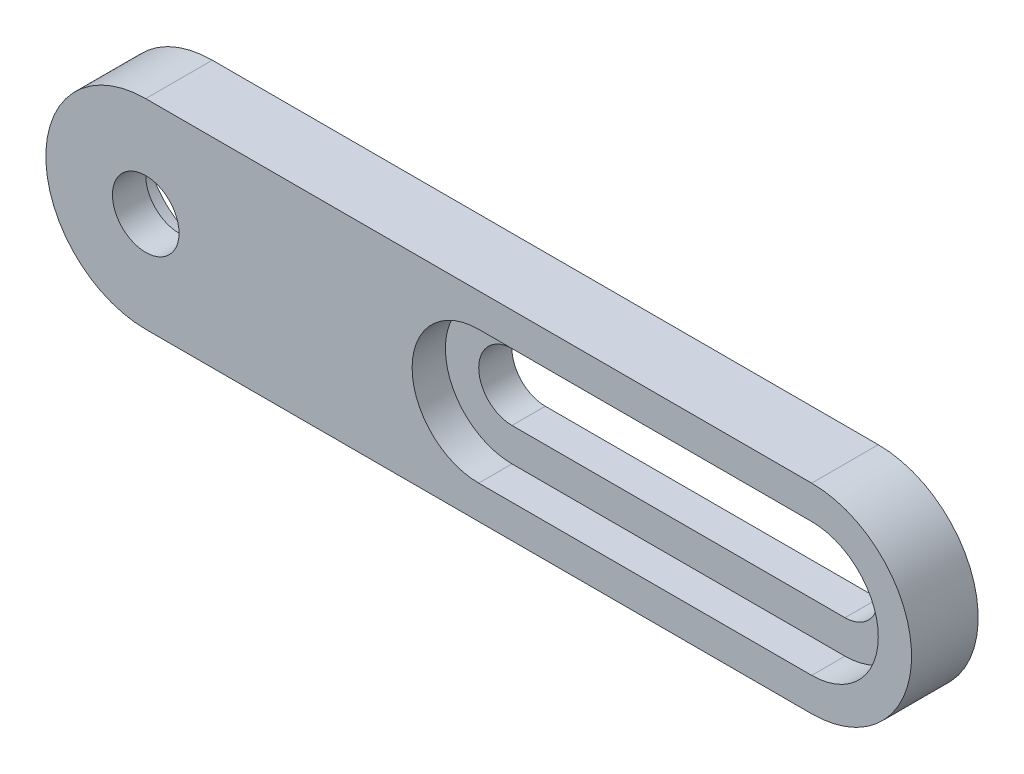
ISO-10303-21;
HEADER;
FILE_DESCRIPTION(('STEP AP214'),'2;1');
FILE_NAME('part.step','',(''),(''),'','','');
FILE_SCHEMA(('AUTOMOTIVE_DESIGN { 1 0 10303 214 1 1 1 1 }'));
ENDSEC;
DATA;
#1=APPLICATION_CONTEXT('core data for automotive mechanical design processes');
#2=APPLICATION_PROTOCOL_DEFINITION('international standard','automotive_design',2000,#1);
#3=PRODUCT_CONTEXT('',#1,'mechanical');
#4=PRODUCT('Part','Part','',(#3));
#5=PRODUCT_RELATED_PRODUCT_CATEGORY('part','',(#4));
#6=PRODUCT_DEFINITION_FORMATION('','',#4);
#7=PRODUCT_DEFINITION_CONTEXT('part definition',#1,'design');
#8=PRODUCT_DEFINITION('design','',#6,#7);
#9=PRODUCT_DEFINITION_SHAPE('','',#8);
#10=(LENGTH_UNIT() NAMED_UNIT(*) SI_UNIT(.MILLI.,.METRE.));
#11=(NAMED_UNIT(*) PLANE_ANGLE_UNIT() SI_UNIT($,.RADIAN.));
#12=(NAMED_UNIT(*) SI_UNIT($,.STERADIAN.) SOLID_ANGLE_UNIT());
#13=UNCERTAINTY_MEASURE_WITH_UNIT(LENGTH_MEASURE(1.E-05),#10,'distance_accuracy_value','');
#14=(GEOMETRIC_REPRESENTATION_CONTEXT(3) GLOBAL_UNCERTAINTY_ASSIGNED_CONTEXT((#13)) GLOBAL_UNIT_ASSIGNED_CONTEXT((#10,
#11,#12)) REPRESENTATION_CONTEXT('',''));
#15=CARTESIAN_POINT('',(0.,0.,0.));
#16=DIRECTION('',(0.,0.,1.));
#17=DIRECTION('',(1.,0.,0.));
#18=AXIS2_PLACEMENT_3D('',#15,#16,#17);
#19=CARTESIAN_POINT('',(50.,0.,-10.));
#20=DIRECTION('',(0.,0.,1.));
#21=DIRECTION('',(1.,0.,0.));
#22=AXIS2_PLACEMENT_3D('',#19,#20,#21);
#23=CYLINDRICAL_SURFACE('',#22,2.5);
#24=CARTESIAN_POINT('',(50.,0.,-2.5));
#25=DIRECTION('',(0.,0.,1.));
#26=DIRECTION('',(1.,0.,0.));
#27=AXIS2_PLACEMENT_3D('',#24,#25,#26);
#28=CIRCLE('',#27,2.5);
#29=CARTESIAN_POINT('',(50.,2.5,-2.5));
#30=VERTEX_POINT('',#29);
#31=CARTESIAN_POINT('',(50.,-2.5,-2.5));
#32=VERTEX_POINT('',#31);
#33=EDGE_CURVE('E61',#30,#32,#28,.F.);
#34=ORIENTED_EDGE('',*,*,#33,.F.);
#35=DIRECTION('',(0.,0.,1.));
#36=VECTOR('',#35,1.);
#37=CARTESIAN_POINT('',(50.,2.5,-5.));
#38=LINE('',#37,#36);
#39=CARTESIAN_POINT('',(50.,2.5,-5.));
#40=VERTEX_POINT('',#39);
#41=EDGE_CURVE('E183',#40,#30,#38,.T.);
#42=ORIENTED_EDGE('',*,*,#41,.F.);
#43=CARTESIAN_POINT('',(50.,0.,-5.));
#44=DIRECTION('',(0.,0.,1.));
#45=DIRECTION('',(1.,0.,0.));
#46=AXIS2_PLACEMENT_3D('',#43,#44,#45);
#47=CIRCLE('',#46,2.5);
#48=CARTESIAN_POINT('',(50.,-2.5,-5.));
#49=VERTEX_POINT('',#48);
#50=EDGE_CURVE('E194',#49,#40,#47,.T.);
#51=ORIENTED_EDGE('',*,*,#50,.F.);
#52=DIRECTION('',(0.,0.,1.));
#53=VECTOR('',#52,1.);
#54=CARTESIAN_POINT('',(50.,-2.5,-5.));
#55=LINE('',#54,#53);
#56=EDGE_CURVE('E186',#49,#32,#55,.T.);
#57=ORIENTED_EDGE('',*,*,#56,.T.);
#58=EDGE_LOOP('',(#34,#42,#51,#57));
#59=FACE_BOUND('',#58,.T.);
#60=ADVANCED_FACE('F39',(#59),#23,.F.);
#61=CARTESIAN_POINT('',(25.,0.,-5.));
#62=DIRECTION('',(0.,0.,1.));
#63=DIRECTION('',(1.,0.,0.));
#64=AXIS2_PLACEMENT_3D('',#61,#62,#63);
#65=CYLINDRICAL_SURFACE('',#64,2.5);
#66=CARTESIAN_POINT('',(25.,0.,-2.5));
#67=DIRECTION('',(0.,0.,1.));
#68=DIRECTION('',(1.,0.,0.));
#69=AXIS2_PLACEMENT_3D('',#66,#67,#68);
#70=CIRCLE('',#69,2.5);
#71=CARTESIAN_POINT('',(25.,-2.5,-2.5));
#72=VERTEX_POINT('',#71);
#73=CARTESIAN_POINT('',(25.,2.5,-2.5));
#74=VERTEX_POINT('',#73);
#75=EDGE_CURVE('E162',#72,#74,#70,.F.);
#76=ORIENTED_EDGE('',*,*,#75,.F.);
#77=DIRECTION('',(0.,0.,1.));
#78=VECTOR('',#77,1.);
#79=CARTESIAN_POINT('',(25.,-2.5,-5.));
#80=LINE('',#79,#78);
#81=CARTESIAN_POINT('',(25.,-2.5,-5.));
#82=VERTEX_POINT('',#81);
#83=EDGE_CURVE('E178',#82,#72,#80,.T.);
#84=ORIENTED_EDGE('',*,*,#83,.F.);
#85=CARTESIAN_POINT('',(25.,0.,-5.));
#86=DIRECTION('',(0.,0.,1.));
#87=DIRECTION('',(1.,0.,0.));
#88=AXIS2_PLACEMENT_3D('',#85,#86,#87);
#89=CIRCLE('',#88,2.5);
#90=CARTESIAN_POINT('',(25.,2.5,-5.));
#91=VERTEX_POINT('',#90);
#92=EDGE_CURVE('E169',#91,#82,#89,.T.);
#93=ORIENTED_EDGE('',*,*,#92,.F.);
#94=DIRECTION('',(0.,0.,1.));
#95=VECTOR('',#94,1.);
#96=CARTESIAN_POINT('',(25.,2.5,-5.));
#97=LINE('',#96,#95);
#98=EDGE_CURVE('E179',#91,#74,#97,.T.);
#99=ORIENTED_EDGE('',*,*,#98,.T.);
#100=EDGE_LOOP('',(#76,#84,#93,#99));
#101=FACE_BOUND('',#100,.T.);
#102=ADVANCED_FACE('F281',(#101),#65,.F.);
#103=CARTESIAN_POINT('',(25.,2.5,-5.));
#104=DIRECTION('',(0.,1.,0.));
#105=DIRECTION('',(-1.,0.,0.));
#106=AXIS2_PLACEMENT_3D('',#103,#104,#105);
#107=PLANE('',#106);
#108=DIRECTION('',(1.,0.,0.));
#109=VECTOR('',#108,1.);
#110=CARTESIAN_POINT('',(25.,2.5,-2.5));
#111=LINE('',#110,#109);
#112=EDGE_CURVE('E167',#74,#30,#111,.T.);
#113=ORIENTED_EDGE('',*,*,#112,.F.);
#114=ORIENTED_EDGE('',*,*,#98,.F.);
#115=DIRECTION('',(-1.,0.,0.));
#116=VECTOR('',#115,1.);
#117=CARTESIAN_POINT('',(25.,2.5,-5.));
#118=LINE('',#117,#116);
#119=EDGE_CURVE('E175',#40,#91,#118,.T.);
#120=ORIENTED_EDGE('',*,*,#119,.F.);
#121=ORIENTED_EDGE('',*,*,#41,.T.);
#122=EDGE_LOOP('',(#113,#114,#120,#121));
#123=FACE_BOUND('',#122,.T.);
#124=ADVANCED_FACE('F287',(#123),#107,.F.);
#125=CARTESIAN_POINT('',(25.,-2.5,-5.));
#126=DIRECTION('',(0.,-1.,0.));
#127=DIRECTION('',(1.,0.,0.));
#128=AXIS2_PLACEMENT_3D('',#125,#126,#127);
#129=PLANE('',#128);
#130=DIRECTION('',(-1.,0.,0.));
#131=VECTOR('',#130,1.);
#132=CARTESIAN_POINT('',(25.,-2.5,-2.5));
#133=LINE('',#132,#131);
#134=EDGE_CURVE('E11',#32,#72,#133,.T.);
#135=ORIENTED_EDGE('',*,*,#134,.F.);
#136=ORIENTED_EDGE('',*,*,#56,.F.);
#137=DIRECTION('',(1.,0.,0.));
#138=VECTOR('',#137,1.);
#139=CARTESIAN_POINT('',(25.,-2.5,-5.));
#140=LINE('',#139,#138);
#141=EDGE_CURVE('E172',#82,#49,#140,.T.);
#142=ORIENTED_EDGE('',*,*,#141,.F.);
#143=ORIENTED_EDGE('',*,*,#83,.T.);
#144=EDGE_LOOP('',(#135,#136,#142,#143));
#145=FACE_BOUND('',#144,.T.);
#146=ADVANCED_FACE('F293',(#145),#129,.F.);
#147=CARTESIAN_POINT('',(0.,0.,-5.));
#148=DIRECTION('',(0.,0.,1.));
#149=DIRECTION('',(1.,0.,0.));
#150=AXIS2_PLACEMENT_3D('',#147,#148,#149);
#151=CYLINDRICAL_SURFACE('',#150,7.5);
#152=CARTESIAN_POINT('',(0.,0.,0.));
#153=DIRECTION('',(0.,0.,1.));
#154=DIRECTION('',(1.,0.,0.));
#155=AXIS2_PLACEMENT_3D('',#152,#153,#154);
#156=CIRCLE('',#155,7.5);
#157=CARTESIAN_POINT('',(0.,7.5,0.));
#158=VERTEX_POINT('',#157);
#159=CARTESIAN_POINT('',(0.,-7.5,0.));
#160=VERTEX_POINT('',#159);
#161=EDGE_CURVE('E201',#158,#160,#156,.T.);
#162=ORIENTED_EDGE('',*,*,#161,.F.);
#163=DIRECTION('',(0.,0.,1.));
#164=VECTOR('',#163,1.);
#165=CARTESIAN_POINT('',(0.,7.5,-5.));
#166=LINE('',#165,#164);
#167=CARTESIAN_POINT('',(0.,7.5,-5.));
#168=VERTEX_POINT('',#167);
#169=EDGE_CURVE('E47',#168,#158,#166,.T.);
#170=ORIENTED_EDGE('',*,*,#169,.F.);
#171=CARTESIAN_POINT('',(0.,0.,-5.));
#172=DIRECTION('',(0.,0.,1.));
#173=DIRECTION('',(1.,0.,0.));
#174=AXIS2_PLACEMENT_3D('',#171,#172,#173);
#175=CIRCLE('',#174,7.5);
#176=CARTESIAN_POINT('',(0.,-7.5,-5.));
#177=VERTEX_POINT('',#176);
#178=EDGE_CURVE('E204',#168,#177,#175,.T.);
#179=ORIENTED_EDGE('',*,*,#178,.T.);
#180=DIRECTION('',(0.,0.,1.));
#181=VECTOR('',#180,1.);
#182=CARTESIAN_POINT('',(0.,-7.5,-5.));
#183=LINE('',#182,#181);
#184=EDGE_CURVE('E217',#177,#160,#183,.T.);
#185=ORIENTED_EDGE('',*,*,#184,.T.);
#186=EDGE_LOOP('',(#162,#170,#179,#185));
#187=FACE_BOUND('',#186,.T.);
#188=ADVANCED_FACE('F41',(#187),#151,.T.);
#189=CARTESIAN_POINT('',(0.,7.5,-5.));
#190=DIRECTION('',(0.,1.,0.));
#191=DIRECTION('',(0.,0.,1.));
#192=AXIS2_PLACEMENT_3D('',#189,#190,#191);
#193=PLANE('',#192);
#194=DIRECTION('',(-1.,0.,0.));
#195=VECTOR('',#194,1.);
#196=CARTESIAN_POINT('',(0.,7.5,0.));
#197=LINE('',#196,#195);
#198=CARTESIAN_POINT('',(50.,7.5,0.));
#199=VERTEX_POINT('',#198);
#200=EDGE_CURVE('E208',#199,#158,#197,.T.);
#201=ORIENTED_EDGE('',*,*,#200,.F.);
#202=DIRECTION('',(0.,0.,1.));
#203=VECTOR('',#202,1.);
#204=CARTESIAN_POINT('',(50.,7.5,-5.));
#205=LINE('',#204,#203);
#206=CARTESIAN_POINT('',(50.,7.5,-5.));
#207=VERTEX_POINT('',#206);
#208=EDGE_CURVE('E229',#207,#199,#205,.T.);
#209=ORIENTED_EDGE('',*,*,#208,.F.);
#210=DIRECTION('',(-1.,0.,0.));
#211=VECTOR('',#210,1.);
#212=CARTESIAN_POINT('',(0.,7.5,-5.));
#213=LINE('',#212,#211);
#214=EDGE_CURVE('E214',#207,#168,#213,.T.);
#215=ORIENTED_EDGE('',*,*,#214,.T.);
#216=ORIENTED_EDGE('',*,*,#169,.T.);
#217=EDGE_LOOP('',(#201,#209,#215,#216));
#218=FACE_BOUND('',#217,.T.);
#219=ADVANCED_FACE('F265',(#218),#193,.T.);
#220=CARTESIAN_POINT('',(50.,0.,-5.));
#221=DIRECTION('',(0.,0.,1.));
#222=DIRECTION('',(1.,0.,0.));
#223=AXIS2_PLACEMENT_3D('',#220,#221,#222);
#224=CYLINDRICAL_SURFACE('',#223,7.5);
#225=CARTESIAN_POINT('',(50.,0.,0.));
#226=DIRECTION('',(0.,0.,1.));
#227=DIRECTION('',(1.,0.,0.));
#228=AXIS2_PLACEMENT_3D('',#225,#226,#227);
#229=CIRCLE('',#228,7.5);
#230=CARTESIAN_POINT('',(50.,-7.5,0.));
#231=VERTEX_POINT('',#230);
#232=EDGE_CURVE('E223',#231,#199,#229,.T.);
#233=ORIENTED_EDGE('',*,*,#232,.F.);
#234=DIRECTION('',(0.,0.,1.));
#235=VECTOR('',#234,1.);
#236=CARTESIAN_POINT('',(50.,-7.5,-5.));
#237=LINE('',#236,#235);
#238=CARTESIAN_POINT('',(50.,-7.5,-5.));
#239=VERTEX_POINT('',#238);
#240=EDGE_CURVE('E231',#239,#231,#237,.T.);
#241=ORIENTED_EDGE('',*,*,#240,.F.);
#242=CARTESIAN_POINT('',(50.,0.,-5.));
#243=DIRECTION('',(0.,0.,1.));
#244=DIRECTION('',(1.,0.,0.));
#245=AXIS2_PLACEMENT_3D('',#242,#243,#244);
#246=CIRCLE('',#245,7.5);
#247=EDGE_CURVE('E211',#239,#207,#246,.T.);
#248=ORIENTED_EDGE('',*,*,#247,.T.);
#249=ORIENTED_EDGE('',*,*,#208,.T.);
#250=EDGE_LOOP('',(#233,#241,#248,#249));
#251=FACE_BOUND('',#250,.T.);
#252=ADVANCED_FACE('F269',(#251),#224,.T.);
#253=CARTESIAN_POINT('',(0.,-7.5,-5.));
#254=DIRECTION('',(0.,-1.,0.));
#255=DIRECTION('',(0.,0.,-1.));
#256=AXIS2_PLACEMENT_3D('',#253,#254,#255);
#257=PLANE('',#256);
#258=DIRECTION('',(1.,0.,0.));
#259=VECTOR('',#258,1.);
#260=CARTESIAN_POINT('',(0.,-7.5,0.));
#261=LINE('',#260,#259);
#262=EDGE_CURVE('E220',#160,#231,#261,.T.);
#263=ORIENTED_EDGE('',*,*,#262,.F.);
#264=ORIENTED_EDGE('',*,*,#184,.F.);
#265=DIRECTION('',(1.,0.,0.));
#266=VECTOR('',#265,1.);
#267=CARTESIAN_POINT('',(0.,-7.5,-5.));
#268=LINE('',#267,#266);
#269=EDGE_CURVE('E207',#177,#239,#268,.T.);
#270=ORIENTED_EDGE('',*,*,#269,.T.);
#271=ORIENTED_EDGE('',*,*,#240,.T.);
#272=EDGE_LOOP('',(#263,#264,#270,#271));
#273=FACE_BOUND('',#272,.T.);
#274=ADVANCED_FACE('F255',(#273),#257,.T.);
#275=CARTESIAN_POINT('',(0.,0.,-5.));
#276=DIRECTION('',(0.,0.,1.));
#277=DIRECTION('',(1.,0.,0.));
#278=AXIS2_PLACEMENT_3D('',#275,#276,#277);
#279=PLANE('',#278);
#280=ORIENTED_EDGE('',*,*,#50,.T.);
#281=ORIENTED_EDGE('',*,*,#119,.T.);
#282=ORIENTED_EDGE('',*,*,#92,.T.);
#283=ORIENTED_EDGE('',*,*,#141,.T.);
#284=EDGE_LOOP('',(#280,#281,#282,#283));
#285=FACE_BOUND('',#284,.T.);
#286=CARTESIAN_POINT('',(0.,0.,-5.));
#287=DIRECTION('',(0.,0.,-1.));
#288=DIRECTION('',(-1.,0.,0.));
#289=AXIS2_PLACEMENT_3D('',#286,#287,#288);
#290=CIRCLE('',#289,5.);
#291=CARTESIAN_POINT('',(-5.,0.,-5.));
#292=VERTEX_POINT('',#291);
#293=EDGE_CURVE('E197',#292,#292,#290,.T.);
#294=ORIENTED_EDGE('',*,*,#293,.F.);
#295=EDGE_LOOP('',(#294));
#296=FACE_BOUND('',#295,.T.);
#297=ORIENTED_EDGE('',*,*,#178,.F.);
#298=ORIENTED_EDGE('',*,*,#214,.F.);
#299=ORIENTED_EDGE('',*,*,#247,.F.);
#300=ORIENTED_EDGE('',*,*,#269,.F.);
#301=EDGE_LOOP('',(#297,#298,#299,#300));
#302=FACE_BOUND('',#301,.T.);
#303=ADVANCED_FACE('F252',(#285,#296,#302),#279,.F.);
#304=CARTESIAN_POINT('',(0.,0.,0.));
#305=DIRECTION('',(0.,0.,1.));
#306=DIRECTION('',(1.,0.,0.));
#307=AXIS2_PLACEMENT_3D('',#304,#305,#306);
#308=PLANE('',#307);
#309=CARTESIAN_POINT('',(50.,0.,0.));
#310=DIRECTION('',(0.,0.,1.));
#311=DIRECTION('',(1.,0.,0.));
#312=AXIS2_PLACEMENT_3D('',#309,#310,#311);
#313=CIRCLE('',#312,5.);
#314=CARTESIAN_POINT('',(50.,-5.,0.));
#315=VERTEX_POINT('',#314);
#316=CARTESIAN_POINT('',(50.,5.,0.));
#317=VERTEX_POINT('',#316);
#318=EDGE_CURVE('E54',#315,#317,#313,.T.);
#319=ORIENTED_EDGE('',*,*,#318,.F.);
#320=DIRECTION('',(-1.,0.,0.));
#321=VECTOR('',#320,1.);
#322=CARTESIAN_POINT('',(0.,-5.00000000000001,0.));
#323=LINE('',#322,#321);
#324=CARTESIAN_POINT('',(25.,-5.,0.));
#325=VERTEX_POINT('',#324);
#326=EDGE_CURVE('E147',#315,#325,#323,.T.);
#327=ORIENTED_EDGE('',*,*,#326,.T.);
#328=CARTESIAN_POINT('',(25.,0.,0.));
#329=DIRECTION('',(0.,0.,1.));
#330=DIRECTION('',(1.,0.,0.));
#331=AXIS2_PLACEMENT_3D('',#328,#329,#330);
#332=CIRCLE('',#331,5.);
#333=CARTESIAN_POINT('',(25.,5.,0.));
#334=VERTEX_POINT('',#333);
#335=EDGE_CURVE('E155',#334,#325,#332,.T.);
#336=ORIENTED_EDGE('',*,*,#335,.F.);
#337=DIRECTION('',(-1.,0.,0.));
#338=VECTOR('',#337,1.);
#339=CARTESIAN_POINT('',(0.,5.,0.));
#340=LINE('',#339,#338);
#341=EDGE_CURVE('E153',#317,#334,#340,.T.);
#342=ORIENTED_EDGE('',*,*,#341,.F.);
#343=EDGE_LOOP('',(#319,#327,#336,#342));
#344=FACE_BOUND('',#343,.T.);
#345=CARTESIAN_POINT('',(0.,0.,0.));
#346=DIRECTION('',(0.,0.,1.));
#347=DIRECTION('',(1.,0.,0.));
#348=AXIS2_PLACEMENT_3D('',#345,#346,#347);
#349=CIRCLE('',#348,2.5);
#350=CARTESIAN_POINT('',(2.5,0.,0.));
#351=VERTEX_POINT('',#350);
#352=EDGE_CURVE('E182',#351,#351,#349,.T.);
#353=ORIENTED_EDGE('',*,*,#352,.F.);
#354=EDGE_LOOP('',(#353));
#355=FACE_BOUND('',#354,.T.);
#356=ORIENTED_EDGE('',*,*,#161,.T.);
#357=ORIENTED_EDGE('',*,*,#262,.T.);
#358=ORIENTED_EDGE('',*,*,#232,.T.);
#359=ORIENTED_EDGE('',*,*,#200,.T.);
#360=EDGE_LOOP('',(#356,#357,#358,#359));
#361=FACE_BOUND('',#360,.T.);
#362=ADVANCED_FACE('F248',(#344,#355,#361),#308,.T.);
#363=CARTESIAN_POINT('',(0.,0.,-2.5));
#364=DIRECTION('',(0.,0.,-1.));
#365=DIRECTION('',(-1.,0.,0.));
#366=AXIS2_PLACEMENT_3D('',#363,#364,#365);
#367=CYLINDRICAL_SURFACE('',#366,5.);
#368=CARTESIAN_POINT('',(0.,0.,-2.5));
#369=DIRECTION('',(0.,0.,-1.));
#370=DIRECTION('',(-1.,0.,0.));
#371=AXIS2_PLACEMENT_3D('',#368,#369,#370);
#372=CIRCLE('',#371,5.);
#373=CARTESIAN_POINT('',(-5.,0.,-2.5));
#374=VERTEX_POINT('',#373);
#375=EDGE_CURVE('E198',#374,#374,#372,.T.);
#376=ORIENTED_EDGE('',*,*,#375,.F.);
#377=EDGE_LOOP('',(#376));
#378=FACE_BOUND('',#377,.T.);
#379=ORIENTED_EDGE('',*,*,#293,.T.);
#380=EDGE_LOOP('',(#379));
#381=FACE_BOUND('',#380,.T.);
#382=ADVANCED_FACE('F242',(#378,#381),#367,.F.);
#383=CARTESIAN_POINT('',(0.,0.,-2.5));
#384=DIRECTION('',(0.,0.,-1.));
#385=DIRECTION('',(-1.,0.,0.));
#386=AXIS2_PLACEMENT_3D('',#383,#384,#385);
#387=PLANE('',#386);
#388=CARTESIAN_POINT('',(0.,0.,-2.5));
#389=DIRECTION('',(0.,0.,-1.));
#390=DIRECTION('',(-1.,0.,0.));
#391=AXIS2_PLACEMENT_3D('',#388,#389,#390);
#392=CIRCLE('',#391,2.5);
#393=CARTESIAN_POINT('',(-2.5,0.,-2.5));
#394=VERTEX_POINT('',#393);
#395=EDGE_CURVE('E193',#394,#394,#392,.T.);
#396=ORIENTED_EDGE('',*,*,#395,.F.);
#397=EDGE_LOOP('',(#396));
#398=FACE_BOUND('',#397,.T.);
#399=ORIENTED_EDGE('',*,*,#375,.T.);
#400=EDGE_LOOP('',(#399));
#401=FACE_BOUND('',#400,.T.);
#402=ADVANCED_FACE('F239',(#398,#401),#387,.T.);
#403=CARTESIAN_POINT('',(0.,0.,-10.));
#404=DIRECTION('',(0.,0.,1.));
#405=DIRECTION('',(1.,0.,0.));
#406=AXIS2_PLACEMENT_3D('',#403,#404,#405);
#407=CYLINDRICAL_SURFACE('',#406,2.5);
#408=ORIENTED_EDGE('',*,*,#395,.T.);
#409=EDGE_LOOP('',(#408));
#410=FACE_BOUND('',#409,.T.);
#411=ORIENTED_EDGE('',*,*,#352,.T.);
#412=EDGE_LOOP('',(#411));
#413=FACE_BOUND('',#412,.T.);
#414=ADVANCED_FACE('F236',(#410,#413),#407,.F.);
#415=CARTESIAN_POINT('',(0.,0.,-2.5));
#416=DIRECTION('',(0.,0.,1.));
#417=DIRECTION('',(1.,0.,0.));
#418=AXIS2_PLACEMENT_3D('',#415,#416,#417);
#419=PLANE('',#418);
#420=CARTESIAN_POINT('',(50.,0.,-2.5));
#421=DIRECTION('',(0.,0.,1.));
#422=DIRECTION('',(1.,0.,0.));
#423=AXIS2_PLACEMENT_3D('',#420,#421,#422);
#424=CIRCLE('',#423,5.);
#425=CARTESIAN_POINT('',(50.,-5.,-2.5));
#426=VERTEX_POINT('',#425);
#427=CARTESIAN_POINT('',(50.,5.,-2.5));
#428=VERTEX_POINT('',#427);
#429=EDGE_CURVE('E129',#426,#428,#424,.T.);
#430=ORIENTED_EDGE('',*,*,#429,.T.);
#431=DIRECTION('',(-1.,0.,0.));
#432=VECTOR('',#431,1.);
#433=CARTESIAN_POINT('',(0.,5.,-2.5));
#434=LINE('',#433,#432);
#435=CARTESIAN_POINT('',(25.,5.,-2.5));
#436=VERTEX_POINT('',#435);
#437=EDGE_CURVE('E137',#428,#436,#434,.T.);
#438=ORIENTED_EDGE('',*,*,#437,.T.);
#439=CARTESIAN_POINT('',(25.,0.,-2.5));
#440=DIRECTION('',(0.,0.,1.));
#441=DIRECTION('',(1.,0.,0.));
#442=AXIS2_PLACEMENT_3D('',#439,#440,#441);
#443=CIRCLE('',#442,5.);
#444=CARTESIAN_POINT('',(25.,-5.,-2.5));
#445=VERTEX_POINT('',#444);
#446=EDGE_CURVE('E142',#436,#445,#443,.T.);
#447=ORIENTED_EDGE('',*,*,#446,.T.);
#448=DIRECTION('',(-1.,0.,0.));
#449=VECTOR('',#448,1.);
#450=CARTESIAN_POINT('',(0.,-5.00000000000001,-2.5));
#451=LINE('',#450,#449);
#452=EDGE_CURVE('E134',#426,#445,#451,.T.);
#453=ORIENTED_EDGE('',*,*,#452,.F.);
#454=EDGE_LOOP('',(#430,#438,#447,#453));
#455=FACE_BOUND('',#454,.T.);
#456=ORIENTED_EDGE('',*,*,#112,.T.);
#457=ORIENTED_EDGE('',*,*,#33,.T.);
#458=ORIENTED_EDGE('',*,*,#134,.T.);
#459=ORIENTED_EDGE('',*,*,#75,.T.);
#460=EDGE_LOOP('',(#456,#457,#458,#459));
#461=FACE_BOUND('',#460,.T.);
#462=ADVANCED_FACE('F145',(#455,#461),#419,.T.);
#463=CARTESIAN_POINT('',(50.,0.,-2.5));
#464=DIRECTION('',(0.,0.,1.));
#465=DIRECTION('',(1.,0.,0.));
#466=AXIS2_PLACEMENT_3D('',#463,#464,#465);
#467=CYLINDRICAL_SURFACE('',#466,5.);
#468=ORIENTED_EDGE('',*,*,#318,.T.);
#469=DIRECTION('',(0.,0.,1.));
#470=VECTOR('',#469,1.);
#471=CARTESIAN_POINT('',(50.,5.,-2.5));
#472=LINE('',#471,#470);
#473=EDGE_CURVE('E125',#428,#317,#472,.T.);
#474=ORIENTED_EDGE('',*,*,#473,.F.);
#475=ORIENTED_EDGE('',*,*,#429,.F.);
#476=DIRECTION('',(0.,0.,1.));
#477=VECTOR('',#476,1.);
#478=CARTESIAN_POINT('',(50.,-5.,-2.5));
#479=LINE('',#478,#477);
#480=EDGE_CURVE('E160',#426,#315,#479,.T.);
#481=ORIENTED_EDGE('',*,*,#480,.T.);
#482=EDGE_LOOP('',(#468,#474,#475,#481));
#483=FACE_BOUND('',#482,.T.);
#484=ADVANCED_FACE('F127',(#483),#467,.F.);
#485=CARTESIAN_POINT('',(0.,-5.00000000000001,-2.5));
#486=DIRECTION('',(0.,1.,0.));
#487=DIRECTION('',(-1.,0.,0.));
#488=AXIS2_PLACEMENT_3D('',#485,#486,#487);
#489=PLANE('',#488);
#490=ORIENTED_EDGE('',*,*,#326,.F.);
#491=ORIENTED_EDGE('',*,*,#480,.F.);
#492=ORIENTED_EDGE('',*,*,#452,.T.);
#493=DIRECTION('',(0.,0.,1.));
#494=VECTOR('',#493,1.);
#495=CARTESIAN_POINT('',(25.,-5.,-2.5));
#496=LINE('',#495,#494);
#497=EDGE_CURVE('E163',#445,#325,#496,.T.);
#498=ORIENTED_EDGE('',*,*,#497,.T.);
#499=EDGE_LOOP('',(#490,#491,#492,#498));
#500=FACE_BOUND('',#499,.T.);
#501=ADVANCED_FACE('F302',(#500),#489,.T.);
#502=CARTESIAN_POINT('',(25.,0.,-2.5));
#503=DIRECTION('',(0.,0.,1.));
#504=DIRECTION('',(1.,0.,0.));
#505=AXIS2_PLACEMENT_3D('',#502,#503,#504);
#506=CYLINDRICAL_SURFACE('',#505,5.);
#507=ORIENTED_EDGE('',*,*,#335,.T.);
#508=ORIENTED_EDGE('',*,*,#497,.F.);
#509=ORIENTED_EDGE('',*,*,#446,.F.);
#510=DIRECTION('',(0.,0.,1.));
#511=VECTOR('',#510,1.);
#512=CARTESIAN_POINT('',(25.,5.,-2.5));
#513=LINE('',#512,#511);
#514=EDGE_CURVE('E133',#436,#334,#513,.T.);
#515=ORIENTED_EDGE('',*,*,#514,.T.);
#516=EDGE_LOOP('',(#507,#508,#509,#515));
#517=FACE_BOUND('',#516,.T.);
#518=ADVANCED_FACE('F305',(#517),#506,.F.);
#519=CARTESIAN_POINT('',(0.,5.,-2.5));
#520=DIRECTION('',(0.,1.,0.));
#521=DIRECTION('',(-1.,0.,0.));
#522=AXIS2_PLACEMENT_3D('',#519,#520,#521);
#523=PLANE('',#522);
#524=ORIENTED_EDGE('',*,*,#341,.T.);
#525=ORIENTED_EDGE('',*,*,#514,.F.);
#526=ORIENTED_EDGE('',*,*,#437,.F.);
#527=ORIENTED_EDGE('',*,*,#473,.T.);
#528=EDGE_LOOP('',(#524,#525,#526,#527));
#529=FACE_BOUND('',#528,.T.);
#530=ADVANCED_FACE('F138',(#529),#523,.F.);
#531=CLOSED_SHELL('',(#60,#102,#124,#146,#188,#219,#252,#274,#303,#362,#382,#402,#414,#462,#484,
#501,#518,#530));
#532=MANIFOLD_SOLID_BREP('B2',#531);
#533=ADVANCED_BREP_SHAPE_REPRESENTATION('',(#18,#532),#14);
#534=SHAPE_DEFINITION_REPRESENTATION(#9,#533);
ENDSEC;
END-ISO-10303-21;
